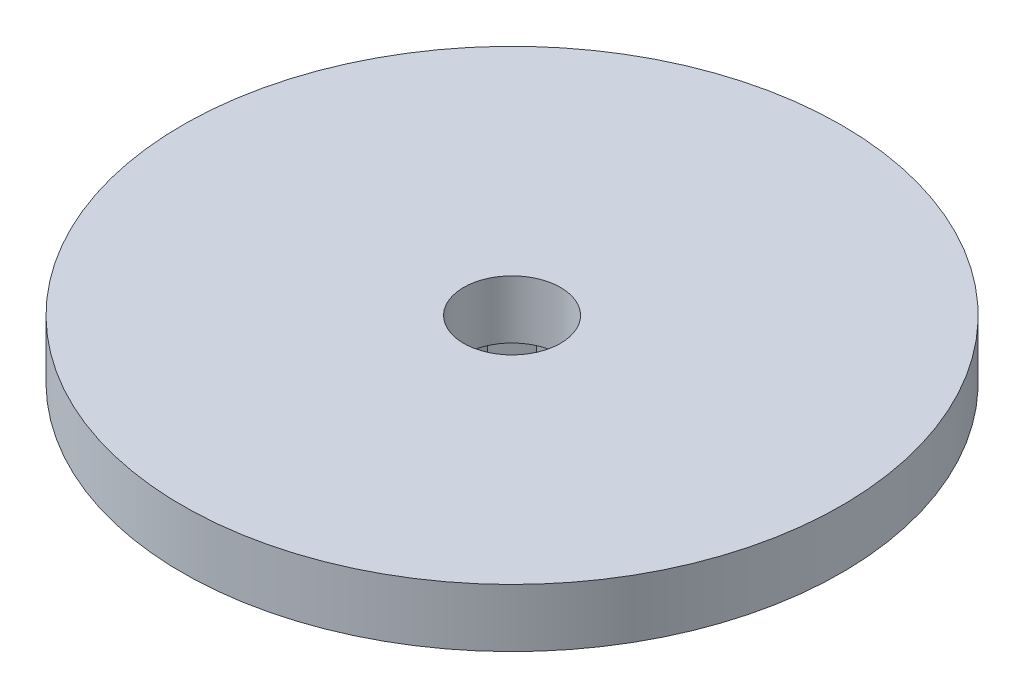
ISO-10303-21;
HEADER;
FILE_DESCRIPTION(('STEP AP214'),'2;1');
FILE_NAME('part.step','',(''),(''),'','','');
FILE_SCHEMA(('AUTOMOTIVE_DESIGN { 1 0 10303 214 1 1 1 1 }'));
ENDSEC;
DATA;
#1=APPLICATION_CONTEXT('core data for automotive mechanical design processes');
#2=APPLICATION_PROTOCOL_DEFINITION('international standard','automotive_design',2000,#1);
#3=PRODUCT_CONTEXT('',#1,'mechanical');
#4=PRODUCT('Part','Part','',(#3));
#5=PRODUCT_RELATED_PRODUCT_CATEGORY('part','',(#4));
#6=PRODUCT_DEFINITION_FORMATION('','',#4);
#7=PRODUCT_DEFINITION_CONTEXT('part definition',#1,'design');
#8=PRODUCT_DEFINITION('design','',#6,#7);
#9=PRODUCT_DEFINITION_SHAPE('','',#8);
#10=(LENGTH_UNIT() NAMED_UNIT(*) SI_UNIT(.MILLI.,.METRE.));
#11=(NAMED_UNIT(*) PLANE_ANGLE_UNIT() SI_UNIT($,.RADIAN.));
#12=(NAMED_UNIT(*) SI_UNIT($,.STERADIAN.) SOLID_ANGLE_UNIT());
#13=UNCERTAINTY_MEASURE_WITH_UNIT(LENGTH_MEASURE(1.E-05),#10,'distance_accuracy_value','');
#14=(GEOMETRIC_REPRESENTATION_CONTEXT(3) GLOBAL_UNCERTAINTY_ASSIGNED_CONTEXT((#13)) GLOBAL_UNIT_ASSIGNED_CONTEXT((#10,
#11,#12)) REPRESENTATION_CONTEXT('',''));
#15=CARTESIAN_POINT('',(0.,0.,0.));
#16=DIRECTION('',(0.,0.,1.));
#17=DIRECTION('',(1.,0.,0.));
#18=AXIS2_PLACEMENT_3D('',#15,#16,#17);
#19=CARTESIAN_POINT('',(0.,0.,0.));
#20=DIRECTION('',(0.,-1.,0.));
#21=DIRECTION('',(0.,0.,-1.));
#22=AXIS2_PLACEMENT_3D('',#19,#20,#21);
#23=CYLINDRICAL_SURFACE('',#22,8.5);
#24=CARTESIAN_POINT('',(0.,2.2,0.));
#25=DIRECTION('',(0.,-1.,0.));
#26=DIRECTION('',(0.,0.,-1.));
#27=AXIS2_PLACEMENT_3D('',#24,#25,#26);
#28=CIRCLE('',#27,8.5);
#29=CARTESIAN_POINT('',(0.,2.2,-8.5));
#30=VERTEX_POINT('',#29);
#31=EDGE_CURVE('E11',#30,#30,#28,.T.);
#32=ORIENTED_EDGE('',*,*,#31,.F.);
#33=EDGE_LOOP('',(#32));
#34=FACE_BOUND('',#33,.T.);
#35=CARTESIAN_POINT('',(0.,3.7,0.));
#36=DIRECTION('',(0.,-1.,0.));
#37=DIRECTION('',(0.,0.,-1.));
#38=AXIS2_PLACEMENT_3D('',#35,#36,#37);
#39=CIRCLE('',#38,8.5);
#40=CARTESIAN_POINT('',(0.,3.7,-8.5));
#41=VERTEX_POINT('',#40);
#42=EDGE_CURVE('E224',#41,#41,#39,.T.);
#43=ORIENTED_EDGE('',*,*,#42,.T.);
#44=EDGE_LOOP('',(#43));
#45=FACE_BOUND('',#44,.T.);
#46=ADVANCED_FACE('F33',(#34,#45),#23,.T.);
#47=CARTESIAN_POINT('',(-8.5,2.2,0.));
#48=DIRECTION('',(0.,1.,0.));
#49=DIRECTION('',(0.,0.,1.));
#50=AXIS2_PLACEMENT_3D('',#47,#48,#49);
#51=PLANE('',#50);
#52=CARTESIAN_POINT('',(0.,2.2,0.));
#53=DIRECTION('',(0.,-1.,0.));
#54=DIRECTION('',(0.,0.,-1.));
#55=AXIS2_PLACEMENT_3D('',#52,#53,#54);
#56=CIRCLE('',#55,3.9);
#57=CARTESIAN_POINT('',(0.,2.2,-3.9));
#58=VERTEX_POINT('',#57);
#59=EDGE_CURVE('E40',#58,#58,#56,.T.);
#60=ORIENTED_EDGE('',*,*,#59,.F.);
#61=EDGE_LOOP('',(#60));
#62=FACE_BOUND('',#61,.T.);
#63=ORIENTED_EDGE('',*,*,#31,.T.);
#64=EDGE_LOOP('',(#63));
#65=FACE_BOUND('',#64,.T.);
#66=ADVANCED_FACE('F265',(#62,#65),#51,.F.);
#67=CARTESIAN_POINT('',(0.,0.,0.));
#68=DIRECTION('',(0.,-1.,0.));
#69=DIRECTION('',(0.,0.,-1.));
#70=AXIS2_PLACEMENT_3D('',#67,#68,#69);
#71=CYLINDRICAL_SURFACE('',#70,3.9);
#72=CARTESIAN_POINT('',(0.,0.,0.));
#73=DIRECTION('',(0.,-1.,0.));
#74=DIRECTION('',(0.,0.,-1.));
#75=AXIS2_PLACEMENT_3D('',#72,#73,#74);
#76=CIRCLE('',#75,3.9);
#77=CARTESIAN_POINT('',(0.,0.,-3.9));
#78=VERTEX_POINT('',#77);
#79=EDGE_CURVE('E258',#78,#78,#76,.T.);
#80=ORIENTED_EDGE('',*,*,#79,.F.);
#81=EDGE_LOOP('',(#80));
#82=FACE_BOUND('',#81,.T.);
#83=ORIENTED_EDGE('',*,*,#59,.T.);
#84=EDGE_LOOP('',(#83));
#85=FACE_BOUND('',#84,.T.);
#86=ADVANCED_FACE('F263',(#82,#85),#71,.T.);
#87=CARTESIAN_POINT('',(-3.9,0.,0.));
#88=DIRECTION('',(0.,1.,0.));
#89=DIRECTION('',(0.,0.,1.));
#90=AXIS2_PLACEMENT_3D('',#87,#88,#89);
#91=PLANE('',#90);
#92=DIRECTION('',(0.707106781186547,0.,0.707106781186548));
#93=VECTOR('',#92,1.);
#94=CARTESIAN_POINT('',(1.27452261903867,0.,-1.90745789630079));
#95=LINE('',#94,#93);
#96=CARTESIAN_POINT('',(1.27452261903867,0.,-1.90745789630079));
#97=VERTEX_POINT('',#96);
#98=CARTESIAN_POINT('',(1.90745789630079,0.,-1.27452261903867));
#99=VERTEX_POINT('',#98);
#100=EDGE_CURVE('E181',#97,#99,#95,.T.);
#101=ORIENTED_EDGE('',*,*,#100,.F.);
#102=DIRECTION('',(0.923879532511287,0.,0.38268343236509));
#103=VECTOR('',#102,1.);
#104=CARTESIAN_POINT('',(0.44755282660423,0.,-2.25));
#105=LINE('',#104,#103);
#106=CARTESIAN_POINT('',(0.44755282660423,0.,-2.25));
#107=VERTEX_POINT('',#106);
#108=EDGE_CURVE('E47',#107,#97,#105,.T.);
#109=ORIENTED_EDGE('',*,*,#108,.F.);
#110=DIRECTION('',(1.,0.,0.));
#111=VECTOR('',#110,1.);
#112=CARTESIAN_POINT('',(-0.447552826604228,0.,-2.25));
#113=LINE('',#112,#111);
#114=CARTESIAN_POINT('',(-0.447552826604228,0.,-2.25));
#115=VERTEX_POINT('',#114);
#116=EDGE_CURVE('E220',#115,#107,#113,.T.);
#117=ORIENTED_EDGE('',*,*,#116,.F.);
#118=DIRECTION('',(0.923879532511287,0.,-0.382683432365089));
#119=VECTOR('',#118,1.);
#120=CARTESIAN_POINT('',(-1.27452261903867,0.,-1.90745789630079));
#121=LINE('',#120,#119);
#122=CARTESIAN_POINT('',(-1.27452261903867,0.,-1.90745789630079));
#123=VERTEX_POINT('',#122);
#124=EDGE_CURVE('E218',#123,#115,#121,.T.);
#125=ORIENTED_EDGE('',*,*,#124,.F.);
#126=DIRECTION('',(0.707106781186548,0.,-0.707106781186548));
#127=VECTOR('',#126,1.);
#128=CARTESIAN_POINT('',(-1.90745789630079,0.,-1.27452261903867));
#129=LINE('',#128,#127);
#130=CARTESIAN_POINT('',(-1.90745789630079,0.,-1.27452261903867));
#131=VERTEX_POINT('',#130);
#132=EDGE_CURVE('E155',#131,#123,#129,.T.);
#133=ORIENTED_EDGE('',*,*,#132,.F.);
#134=DIRECTION('',(0.38268343236509,0.,-0.923879532511287));
#135=VECTOR('',#134,1.);
#136=CARTESIAN_POINT('',(-2.25,0.,-0.44755282660423));
#137=LINE('',#136,#135);
#138=CARTESIAN_POINT('',(-2.25,0.,-0.44755282660423));
#139=VERTEX_POINT('',#138);
#140=EDGE_CURVE('E214',#139,#131,#137,.T.);
#141=ORIENTED_EDGE('',*,*,#140,.F.);
#142=DIRECTION('',(0.,0.,-1.));
#143=VECTOR('',#142,1.);
#144=CARTESIAN_POINT('',(-2.25,0.,0.447552826604228));
#145=LINE('',#144,#143);
#146=CARTESIAN_POINT('',(-2.25,0.,0.447552826604228));
#147=VERTEX_POINT('',#146);
#148=EDGE_CURVE('E211',#147,#139,#145,.T.);
#149=ORIENTED_EDGE('',*,*,#148,.F.);
#150=DIRECTION('',(-0.382683432365089,0.,-0.923879532511287));
#151=VECTOR('',#150,1.);
#152=CARTESIAN_POINT('',(-1.90745789630079,0.,1.27452261903867));
#153=LINE('',#152,#151);
#154=CARTESIAN_POINT('',(-1.90745789630079,0.,1.27452261903867));
#155=VERTEX_POINT('',#154);
#156=EDGE_CURVE('E208',#155,#147,#153,.T.);
#157=ORIENTED_EDGE('',*,*,#156,.F.);
#158=DIRECTION('',(-0.707106781186547,0.,-0.707106781186548));
#159=VECTOR('',#158,1.);
#160=CARTESIAN_POINT('',(-1.27452261903867,0.,1.90745789630079));
#161=LINE('',#160,#159);
#162=CARTESIAN_POINT('',(-1.27452261903867,0.,1.90745789630079));
#163=VERTEX_POINT('',#162);
#164=EDGE_CURVE('E205',#163,#155,#161,.T.);
#165=ORIENTED_EDGE('',*,*,#164,.F.);
#166=DIRECTION('',(-0.923879532511287,0.,-0.38268343236509));
#167=VECTOR('',#166,1.);
#168=CARTESIAN_POINT('',(-0.44755282660423,0.,2.25));
#169=LINE('',#168,#167);
#170=CARTESIAN_POINT('',(-0.44755282660423,0.,2.25));
#171=VERTEX_POINT('',#170);
#172=EDGE_CURVE('E202',#171,#163,#169,.T.);
#173=ORIENTED_EDGE('',*,*,#172,.F.);
#174=DIRECTION('',(-1.,0.,0.));
#175=VECTOR('',#174,1.);
#176=CARTESIAN_POINT('',(0.447552826604228,0.,2.25));
#177=LINE('',#176,#175);
#178=CARTESIAN_POINT('',(0.447552826604228,0.,2.25));
#179=VERTEX_POINT('',#178);
#180=EDGE_CURVE('E199',#179,#171,#177,.T.);
#181=ORIENTED_EDGE('',*,*,#180,.F.);
#182=DIRECTION('',(-0.923879532511287,0.,0.382683432365089));
#183=VECTOR('',#182,1.);
#184=CARTESIAN_POINT('',(1.27452261903867,0.,1.90745789630079));
#185=LINE('',#184,#183);
#186=CARTESIAN_POINT('',(1.27452261903867,0.,1.90745789630079));
#187=VERTEX_POINT('',#186);
#188=EDGE_CURVE('E196',#187,#179,#185,.T.);
#189=ORIENTED_EDGE('',*,*,#188,.F.);
#190=DIRECTION('',(-0.707106781186548,0.,0.707106781186547));
#191=VECTOR('',#190,1.);
#192=CARTESIAN_POINT('',(1.90745789630079,0.,1.27452261903867));
#193=LINE('',#192,#191);
#194=CARTESIAN_POINT('',(1.90745789630079,0.,1.27452261903867));
#195=VERTEX_POINT('',#194);
#196=EDGE_CURVE('E193',#195,#187,#193,.T.);
#197=ORIENTED_EDGE('',*,*,#196,.F.);
#198=DIRECTION('',(-0.38268343236509,0.,0.923879532511287));
#199=VECTOR('',#198,1.);
#200=CARTESIAN_POINT('',(2.25,0.,0.447552826604231));
#201=LINE('',#200,#199);
#202=CARTESIAN_POINT('',(2.25,0.,0.447552826604231));
#203=VERTEX_POINT('',#202);
#204=EDGE_CURVE('E190',#203,#195,#201,.T.);
#205=ORIENTED_EDGE('',*,*,#204,.F.);
#206=DIRECTION('',(0.,0.,1.));
#207=VECTOR('',#206,1.);
#208=CARTESIAN_POINT('',(2.25,0.,-0.447552826604229));
#209=LINE('',#208,#207);
#210=CARTESIAN_POINT('',(2.25,0.,-0.447552826604229));
#211=VERTEX_POINT('',#210);
#212=EDGE_CURVE('E187',#211,#203,#209,.T.);
#213=ORIENTED_EDGE('',*,*,#212,.F.);
#214=DIRECTION('',(0.382683432365089,0.,0.923879532511287));
#215=VECTOR('',#214,1.);
#216=CARTESIAN_POINT('',(1.90745789630079,0.,-1.27452261903867));
#217=LINE('',#216,#215);
#218=EDGE_CURVE('E184',#99,#211,#217,.T.);
#219=ORIENTED_EDGE('',*,*,#218,.F.);
#220=EDGE_LOOP('',(#101,#109,#117,#125,#133,#141,#149,#157,#165,#173,#181,#189,#197,#205,#213,#219));
#221=FACE_BOUND('',#220,.T.);
#222=ORIENTED_EDGE('',*,*,#79,.T.);
#223=EDGE_LOOP('',(#222));
#224=FACE_BOUND('',#223,.T.);
#225=ADVANCED_FACE('F288',(#221,#224),#91,.F.);
#226=CARTESIAN_POINT('',(-2.2,2.2,0.));
#227=DIRECTION('',(0.,1.,0.));
#228=DIRECTION('',(0.,0.,1.));
#229=AXIS2_PLACEMENT_3D('',#226,#227,#228);
#230=PLANE('',#229);
#231=CARTESIAN_POINT('',(0.,2.2,0.));
#232=DIRECTION('',(0.,-1.,0.));
#233=DIRECTION('',(0.,0.,-1.));
#234=AXIS2_PLACEMENT_3D('',#231,#232,#233);
#235=CIRCLE('',#234,1.25);
#236=CARTESIAN_POINT('',(0.,2.2,-1.25));
#237=VERTEX_POINT('',#236);
#238=EDGE_CURVE('E255',#237,#237,#235,.T.);
#239=ORIENTED_EDGE('',*,*,#238,.F.);
#240=EDGE_LOOP('',(#239));
#241=FACE_BOUND('',#240,.T.);
#242=DIRECTION('',(0.923879532511287,0.,0.38268343236509));
#243=VECTOR('',#242,1.);
#244=CARTESIAN_POINT('',(0.44755282660423,2.2,-2.25));
#245=LINE('',#244,#243);
#246=CARTESIAN_POINT('',(0.44755282660423,2.2,-2.25));
#247=VERTEX_POINT('',#246);
#248=CARTESIAN_POINT('',(1.27452261903867,2.2,-1.90745789630079));
#249=VERTEX_POINT('',#248);
#250=EDGE_CURVE('E222',#247,#249,#245,.T.);
#251=ORIENTED_EDGE('',*,*,#250,.T.);
#252=DIRECTION('',(0.707106781186547,0.,0.707106781186548));
#253=VECTOR('',#252,1.);
#254=CARTESIAN_POINT('',(1.27452261903867,2.2,-1.90745789630079));
#255=LINE('',#254,#253);
#256=CARTESIAN_POINT('',(1.90745789630079,2.2,-1.27452261903867));
#257=VERTEX_POINT('',#256);
#258=EDGE_CURVE('E485',#249,#257,#255,.T.);
#259=ORIENTED_EDGE('',*,*,#258,.T.);
#260=DIRECTION('',(0.382683432365089,0.,0.923879532511287));
#261=VECTOR('',#260,1.);
#262=CARTESIAN_POINT('',(1.90745789630079,2.2,-1.27452261903867));
#263=LINE('',#262,#261);
#264=CARTESIAN_POINT('',(2.25,2.2,-0.447552826604229));
#265=VERTEX_POINT('',#264);
#266=EDGE_CURVE('E481',#257,#265,#263,.T.);
#267=ORIENTED_EDGE('',*,*,#266,.T.);
#268=DIRECTION('',(0.,0.,1.));
#269=VECTOR('',#268,1.);
#270=CARTESIAN_POINT('',(2.25,2.2,-0.447552826604229));
#271=LINE('',#270,#269);
#272=CARTESIAN_POINT('',(2.25,2.2,0.447552826604231));
#273=VERTEX_POINT('',#272);
#274=EDGE_CURVE('E484',#265,#273,#271,.T.);
#275=ORIENTED_EDGE('',*,*,#274,.T.);
#276=DIRECTION('',(-0.38268343236509,0.,0.923879532511287));
#277=VECTOR('',#276,1.);
#278=CARTESIAN_POINT('',(2.25,2.2,0.447552826604231));
#279=LINE('',#278,#277);
#280=CARTESIAN_POINT('',(1.90745789630079,2.2,1.27452261903867));
#281=VERTEX_POINT('',#280);
#282=EDGE_CURVE('E491',#273,#281,#279,.T.);
#283=ORIENTED_EDGE('',*,*,#282,.T.);
#284=DIRECTION('',(-0.707106781186548,0.,0.707106781186547));
#285=VECTOR('',#284,1.);
#286=CARTESIAN_POINT('',(1.90745789630079,2.2,1.27452261903867));
#287=LINE('',#286,#285);
#288=CARTESIAN_POINT('',(1.27452261903867,2.2,1.90745789630079));
#289=VERTEX_POINT('',#288);
#290=EDGE_CURVE('E494',#281,#289,#287,.T.);
#291=ORIENTED_EDGE('',*,*,#290,.T.);
#292=DIRECTION('',(-0.923879532511287,0.,0.382683432365089));
#293=VECTOR('',#292,1.);
#294=CARTESIAN_POINT('',(1.27452261903867,2.2,1.90745789630079));
#295=LINE('',#294,#293);
#296=CARTESIAN_POINT('',(0.447552826604228,2.2,2.25));
#297=VERTEX_POINT('',#296);
#298=EDGE_CURVE('E497',#289,#297,#295,.T.);
#299=ORIENTED_EDGE('',*,*,#298,.T.);
#300=DIRECTION('',(-1.,0.,0.));
#301=VECTOR('',#300,1.);
#302=CARTESIAN_POINT('',(0.447552826604228,2.2,2.25));
#303=LINE('',#302,#301);
#304=CARTESIAN_POINT('',(-0.44755282660423,2.2,2.25));
#305=VERTEX_POINT('',#304);
#306=EDGE_CURVE('E500',#297,#305,#303,.T.);
#307=ORIENTED_EDGE('',*,*,#306,.T.);
#308=DIRECTION('',(-0.923879532511287,0.,-0.38268343236509));
#309=VECTOR('',#308,1.);
#310=CARTESIAN_POINT('',(-0.44755282660423,2.2,2.25));
#311=LINE('',#310,#309);
#312=CARTESIAN_POINT('',(-1.27452261903867,2.2,1.90745789630079));
#313=VERTEX_POINT('',#312);
#314=EDGE_CURVE('E503',#305,#313,#311,.T.);
#315=ORIENTED_EDGE('',*,*,#314,.T.);
#316=DIRECTION('',(-0.707106781186547,0.,-0.707106781186548));
#317=VECTOR('',#316,1.);
#318=CARTESIAN_POINT('',(-1.27452261903867,2.2,1.90745789630079));
#319=LINE('',#318,#317);
#320=CARTESIAN_POINT('',(-1.90745789630079,2.2,1.27452261903867));
#321=VERTEX_POINT('',#320);
#322=EDGE_CURVE('E506',#313,#321,#319,.T.);
#323=ORIENTED_EDGE('',*,*,#322,.T.);
#324=DIRECTION('',(-0.382683432365089,0.,-0.923879532511287));
#325=VECTOR('',#324,1.);
#326=CARTESIAN_POINT('',(-1.90745789630079,2.2,1.27452261903867));
#327=LINE('',#326,#325);
#328=CARTESIAN_POINT('',(-2.25,2.2,0.447552826604228));
#329=VERTEX_POINT('',#328);
#330=EDGE_CURVE('E509',#321,#329,#327,.T.);
#331=ORIENTED_EDGE('',*,*,#330,.T.);
#332=DIRECTION('',(0.,0.,-1.));
#333=VECTOR('',#332,1.);
#334=CARTESIAN_POINT('',(-2.25,2.2,0.447552826604228));
#335=LINE('',#334,#333);
#336=CARTESIAN_POINT('',(-2.25,2.2,-0.44755282660423));
#337=VERTEX_POINT('',#336);
#338=EDGE_CURVE('E175',#329,#337,#335,.T.);
#339=ORIENTED_EDGE('',*,*,#338,.T.);
#340=DIRECTION('',(0.38268343236509,0.,-0.923879532511287));
#341=VECTOR('',#340,1.);
#342=CARTESIAN_POINT('',(-2.25,2.2,-0.44755282660423));
#343=LINE('',#342,#341);
#344=CARTESIAN_POINT('',(-1.90745789630079,2.2,-1.27452261903867));
#345=VERTEX_POINT('',#344);
#346=EDGE_CURVE('E173',#337,#345,#343,.T.);
#347=ORIENTED_EDGE('',*,*,#346,.T.);
#348=DIRECTION('',(0.707106781186548,0.,-0.707106781186548));
#349=VECTOR('',#348,1.);
#350=CARTESIAN_POINT('',(-1.90745789630079,2.2,-1.27452261903867));
#351=LINE('',#350,#349);
#352=CARTESIAN_POINT('',(-1.27452261903867,2.2,-1.90745789630079));
#353=VERTEX_POINT('',#352);
#354=EDGE_CURVE('E152',#345,#353,#351,.T.);
#355=ORIENTED_EDGE('',*,*,#354,.T.);
#356=DIRECTION('',(0.923879532511287,0.,-0.382683432365089));
#357=VECTOR('',#356,1.);
#358=CARTESIAN_POINT('',(-1.27452261903867,2.2,-1.90745789630079));
#359=LINE('',#358,#357);
#360=CARTESIAN_POINT('',(-0.447552826604228,2.2,-2.25));
#361=VERTEX_POINT('',#360);
#362=EDGE_CURVE('E163',#353,#361,#359,.T.);
#363=ORIENTED_EDGE('',*,*,#362,.T.);
#364=DIRECTION('',(1.,0.,0.));
#365=VECTOR('',#364,1.);
#366=CARTESIAN_POINT('',(-0.447552826604228,2.2,-2.25));
#367=LINE('',#366,#365);
#368=EDGE_CURVE('E167',#361,#247,#367,.T.);
#369=ORIENTED_EDGE('',*,*,#368,.T.);
#370=EDGE_LOOP('',(#251,#259,#267,#275,#283,#291,#299,#307,#315,#323,#331,#339,#347,#355,#363,#369));
#371=FACE_BOUND('',#370,.T.);
#372=ADVANCED_FACE('F170',(#241,#371),#230,.F.);
#373=CARTESIAN_POINT('',(0.,0.,0.));
#374=DIRECTION('',(0.,-1.,0.));
#375=DIRECTION('',(0.,0.,-1.));
#376=AXIS2_PLACEMENT_3D('',#373,#374,#375);
#377=CYLINDRICAL_SURFACE('',#376,1.25);
#378=CARTESIAN_POINT('',(0.,3.7,0.));
#379=DIRECTION('',(0.,-1.,0.));
#380=DIRECTION('',(0.,0.,-1.));
#381=AXIS2_PLACEMENT_3D('',#378,#379,#380);
#382=CIRCLE('',#381,1.25);
#383=CARTESIAN_POINT('',(0.,3.7,-1.25));
#384=VERTEX_POINT('',#383);
#385=EDGE_CURVE('E252',#384,#384,#382,.T.);
#386=ORIENTED_EDGE('',*,*,#385,.F.);
#387=EDGE_LOOP('',(#386));
#388=FACE_BOUND('',#387,.T.);
#389=ORIENTED_EDGE('',*,*,#238,.T.);
#390=EDGE_LOOP('',(#389));
#391=FACE_BOUND('',#390,.T.);
#392=ADVANCED_FACE('F278',(#388,#391),#377,.F.);
#393=CARTESIAN_POINT('',(-8.5,3.7,0.));
#394=DIRECTION('',(0.,-1.,0.));
#395=DIRECTION('',(0.,0.,-1.));
#396=AXIS2_PLACEMENT_3D('',#393,#394,#395);
#397=PLANE('',#396);
#398=ORIENTED_EDGE('',*,*,#42,.F.);
#399=EDGE_LOOP('',(#398));
#400=FACE_BOUND('',#399,.T.);
#401=ORIENTED_EDGE('',*,*,#385,.T.);
#402=EDGE_LOOP('',(#401));
#403=FACE_BOUND('',#402,.T.);
#404=ADVANCED_FACE('F274',(#400,#403),#397,.F.);
#405=CARTESIAN_POINT('',(0.44755282660423,2.2,-2.25));
#406=DIRECTION('',(0.38268343236509,0.,-0.923879532511287));
#407=DIRECTION('',(-0.923879532511287,0.,-0.38268343236509));
#408=AXIS2_PLACEMENT_3D('',#405,#406,#407);
#409=PLANE('',#408);
#410=ORIENTED_EDGE('',*,*,#108,.T.);
#411=DIRECTION('',(0.,-1.,0.));
#412=VECTOR('',#411,1.);
#413=CARTESIAN_POINT('',(1.27452261903867,2.2,-1.90745789630079));
#414=LINE('',#413,#412);
#415=EDGE_CURVE('E107',#249,#97,#414,.T.);
#416=ORIENTED_EDGE('',*,*,#415,.F.);
#417=ORIENTED_EDGE('',*,*,#250,.F.);
#418=DIRECTION('',(0.,-1.,0.));
#419=VECTOR('',#418,1.);
#420=CARTESIAN_POINT('',(0.44755282660423,2.2,-2.25));
#421=LINE('',#420,#419);
#422=EDGE_CURVE('E55',#247,#107,#421,.T.);
#423=ORIENTED_EDGE('',*,*,#422,.T.);
#424=EDGE_LOOP('',(#410,#416,#417,#423));
#425=FACE_BOUND('',#424,.T.);
#426=ADVANCED_FACE('F277',(#425),#409,.F.);
#427=CARTESIAN_POINT('',(-0.447552826604228,2.2,-2.25));
#428=DIRECTION('',(0.,0.,-1.));
#429=DIRECTION('',(-1.,0.,0.));
#430=AXIS2_PLACEMENT_3D('',#427,#428,#429);
#431=PLANE('',#430);
#432=ORIENTED_EDGE('',*,*,#116,.T.);
#433=ORIENTED_EDGE('',*,*,#422,.F.);
#434=ORIENTED_EDGE('',*,*,#368,.F.);
#435=DIRECTION('',(0.,-1.,0.));
#436=VECTOR('',#435,1.);
#437=CARTESIAN_POINT('',(-0.447552826604228,2.2,-2.25));
#438=LINE('',#437,#436);
#439=EDGE_CURVE('E159',#361,#115,#438,.T.);
#440=ORIENTED_EDGE('',*,*,#439,.T.);
#441=EDGE_LOOP('',(#432,#433,#434,#440));
#442=FACE_BOUND('',#441,.T.);
#443=ADVANCED_FACE('F326',(#442),#431,.F.);
#444=CARTESIAN_POINT('',(-1.27452261903867,2.2,-1.90745789630079));
#445=DIRECTION('',(-0.382683432365089,0.,-0.923879532511287));
#446=DIRECTION('',(-0.923879532511287,0.,0.382683432365089));
#447=AXIS2_PLACEMENT_3D('',#444,#445,#446);
#448=PLANE('',#447);
#449=ORIENTED_EDGE('',*,*,#124,.T.);
#450=ORIENTED_EDGE('',*,*,#439,.F.);
#451=ORIENTED_EDGE('',*,*,#362,.F.);
#452=DIRECTION('',(0.,-1.,0.));
#453=VECTOR('',#452,1.);
#454=CARTESIAN_POINT('',(-1.27452261903867,2.2,-1.90745789630079));
#455=LINE('',#454,#453);
#456=EDGE_CURVE('E148',#353,#123,#455,.T.);
#457=ORIENTED_EDGE('',*,*,#456,.T.);
#458=EDGE_LOOP('',(#449,#450,#451,#457));
#459=FACE_BOUND('',#458,.T.);
#460=ADVANCED_FACE('F164',(#459),#448,.F.);
#461=CARTESIAN_POINT('',(-1.90745789630079,2.2,-1.27452261903867));
#462=DIRECTION('',(-0.707106781186548,0.,-0.707106781186548));
#463=DIRECTION('',(-0.707106781186548,0.,0.707106781186548));
#464=AXIS2_PLACEMENT_3D('',#461,#462,#463);
#465=PLANE('',#464);
#466=ORIENTED_EDGE('',*,*,#132,.T.);
#467=ORIENTED_EDGE('',*,*,#456,.F.);
#468=ORIENTED_EDGE('',*,*,#354,.F.);
#469=DIRECTION('',(0.,-1.,0.));
#470=VECTOR('',#469,1.);
#471=CARTESIAN_POINT('',(-1.90745789630079,2.2,-1.27452261903867));
#472=LINE('',#471,#470);
#473=EDGE_CURVE('E160',#345,#131,#472,.T.);
#474=ORIENTED_EDGE('',*,*,#473,.T.);
#475=EDGE_LOOP('',(#466,#467,#468,#474));
#476=FACE_BOUND('',#475,.T.);
#477=ADVANCED_FACE('F150',(#476),#465,.F.);
#478=CARTESIAN_POINT('',(-2.25,2.2,-0.44755282660423));
#479=DIRECTION('',(-0.923879532511287,0.,-0.38268343236509));
#480=DIRECTION('',(-0.38268343236509,0.,0.923879532511287));
#481=AXIS2_PLACEMENT_3D('',#478,#479,#480);
#482=PLANE('',#481);
#483=ORIENTED_EDGE('',*,*,#140,.T.);
#484=ORIENTED_EDGE('',*,*,#473,.F.);
#485=ORIENTED_EDGE('',*,*,#346,.F.);
#486=DIRECTION('',(0.,-1.,0.));
#487=VECTOR('',#486,1.);
#488=CARTESIAN_POINT('',(-2.25,2.2,-0.44755282660423));
#489=LINE('',#488,#487);
#490=EDGE_CURVE('E227',#337,#139,#489,.T.);
#491=ORIENTED_EDGE('',*,*,#490,.T.);
#492=EDGE_LOOP('',(#483,#484,#485,#491));
#493=FACE_BOUND('',#492,.T.);
#494=ADVANCED_FACE('F351',(#493),#482,.F.);
#495=CARTESIAN_POINT('',(-2.25,2.2,0.447552826604228));
#496=DIRECTION('',(-1.,0.,0.));
#497=DIRECTION('',(0.,0.,1.));
#498=AXIS2_PLACEMENT_3D('',#495,#496,#497);
#499=PLANE('',#498);
#500=ORIENTED_EDGE('',*,*,#148,.T.);
#501=ORIENTED_EDGE('',*,*,#490,.F.);
#502=ORIENTED_EDGE('',*,*,#338,.F.);
#503=DIRECTION('',(0.,-1.,0.));
#504=VECTOR('',#503,1.);
#505=CARTESIAN_POINT('',(-2.25,2.2,0.447552826604228));
#506=LINE('',#505,#504);
#507=EDGE_CURVE('E229',#329,#147,#506,.T.);
#508=ORIENTED_EDGE('',*,*,#507,.T.);
#509=EDGE_LOOP('',(#500,#501,#502,#508));
#510=FACE_BOUND('',#509,.T.);
#511=ADVANCED_FACE('F360',(#510),#499,.F.);
#512=CARTESIAN_POINT('',(-1.90745789630079,2.2,1.27452261903867));
#513=DIRECTION('',(-0.923879532511287,0.,0.382683432365089));
#514=DIRECTION('',(0.382683432365089,0.,0.923879532511287));
#515=AXIS2_PLACEMENT_3D('',#512,#513,#514);
#516=PLANE('',#515);
#517=ORIENTED_EDGE('',*,*,#156,.T.);
#518=ORIENTED_EDGE('',*,*,#507,.F.);
#519=ORIENTED_EDGE('',*,*,#330,.F.);
#520=DIRECTION('',(0.,-1.,0.));
#521=VECTOR('',#520,1.);
#522=CARTESIAN_POINT('',(-1.90745789630079,2.2,1.27452261903867));
#523=LINE('',#522,#521);
#524=EDGE_CURVE('E231',#321,#155,#523,.T.);
#525=ORIENTED_EDGE('',*,*,#524,.T.);
#526=EDGE_LOOP('',(#517,#518,#519,#525));
#527=FACE_BOUND('',#526,.T.);
#528=ADVANCED_FACE('F370',(#527),#516,.F.);
#529=CARTESIAN_POINT('',(-1.27452261903867,2.2,1.90745789630079));
#530=DIRECTION('',(-0.707106781186548,0.,0.707106781186547));
#531=DIRECTION('',(0.707106781186547,0.,0.707106781186548));
#532=AXIS2_PLACEMENT_3D('',#529,#530,#531);
#533=PLANE('',#532);
#534=ORIENTED_EDGE('',*,*,#164,.T.);
#535=ORIENTED_EDGE('',*,*,#524,.F.);
#536=ORIENTED_EDGE('',*,*,#322,.F.);
#537=DIRECTION('',(0.,-1.,0.));
#538=VECTOR('',#537,1.);
#539=CARTESIAN_POINT('',(-1.27452261903867,2.2,1.90745789630079));
#540=LINE('',#539,#538);
#541=EDGE_CURVE('E233',#313,#163,#540,.T.);
#542=ORIENTED_EDGE('',*,*,#541,.T.);
#543=EDGE_LOOP('',(#534,#535,#536,#542));
#544=FACE_BOUND('',#543,.T.);
#545=ADVANCED_FACE('F380',(#544),#533,.F.);
#546=CARTESIAN_POINT('',(-0.44755282660423,2.2,2.25));
#547=DIRECTION('',(-0.38268343236509,0.,0.923879532511287));
#548=DIRECTION('',(0.923879532511287,0.,0.38268343236509));
#549=AXIS2_PLACEMENT_3D('',#546,#547,#548);
#550=PLANE('',#549);
#551=ORIENTED_EDGE('',*,*,#172,.T.);
#552=ORIENTED_EDGE('',*,*,#541,.F.);
#553=ORIENTED_EDGE('',*,*,#314,.F.);
#554=DIRECTION('',(0.,-1.,0.));
#555=VECTOR('',#554,1.);
#556=CARTESIAN_POINT('',(-0.44755282660423,2.2,2.25));
#557=LINE('',#556,#555);
#558=EDGE_CURVE('E235',#305,#171,#557,.T.);
#559=ORIENTED_EDGE('',*,*,#558,.T.);
#560=EDGE_LOOP('',(#551,#552,#553,#559));
#561=FACE_BOUND('',#560,.T.);
#562=ADVANCED_FACE('F390',(#561),#550,.F.);
#563=CARTESIAN_POINT('',(0.447552826604228,2.2,2.25));
#564=DIRECTION('',(0.,0.,1.));
#565=DIRECTION('',(1.,0.,0.));
#566=AXIS2_PLACEMENT_3D('',#563,#564,#565);
#567=PLANE('',#566);
#568=ORIENTED_EDGE('',*,*,#180,.T.);
#569=ORIENTED_EDGE('',*,*,#558,.F.);
#570=ORIENTED_EDGE('',*,*,#306,.F.);
#571=DIRECTION('',(0.,-1.,0.));
#572=VECTOR('',#571,1.);
#573=CARTESIAN_POINT('',(0.447552826604228,2.2,2.25));
#574=LINE('',#573,#572);
#575=EDGE_CURVE('E237',#297,#179,#574,.T.);
#576=ORIENTED_EDGE('',*,*,#575,.T.);
#577=EDGE_LOOP('',(#568,#569,#570,#576));
#578=FACE_BOUND('',#577,.T.);
#579=ADVANCED_FACE('F400',(#578),#567,.F.);
#580=CARTESIAN_POINT('',(1.27452261903867,2.2,1.90745789630079));
#581=DIRECTION('',(0.382683432365089,0.,0.923879532511287));
#582=DIRECTION('',(0.923879532511287,0.,-0.382683432365089));
#583=AXIS2_PLACEMENT_3D('',#580,#581,#582);
#584=PLANE('',#583);
#585=ORIENTED_EDGE('',*,*,#188,.T.);
#586=ORIENTED_EDGE('',*,*,#575,.F.);
#587=ORIENTED_EDGE('',*,*,#298,.F.);
#588=DIRECTION('',(0.,-1.,0.));
#589=VECTOR('',#588,1.);
#590=CARTESIAN_POINT('',(1.27452261903867,2.2,1.90745789630079));
#591=LINE('',#590,#589);
#592=EDGE_CURVE('E239',#289,#187,#591,.T.);
#593=ORIENTED_EDGE('',*,*,#592,.T.);
#594=EDGE_LOOP('',(#585,#586,#587,#593));
#595=FACE_BOUND('',#594,.T.);
#596=ADVANCED_FACE('F410',(#595),#584,.F.);
#597=CARTESIAN_POINT('',(1.90745789630079,2.2,1.27452261903867));
#598=DIRECTION('',(0.707106781186547,0.,0.707106781186548));
#599=DIRECTION('',(0.707106781186548,0.,-0.707106781186547));
#600=AXIS2_PLACEMENT_3D('',#597,#598,#599);
#601=PLANE('',#600);
#602=ORIENTED_EDGE('',*,*,#196,.T.);
#603=ORIENTED_EDGE('',*,*,#592,.F.);
#604=ORIENTED_EDGE('',*,*,#290,.F.);
#605=DIRECTION('',(0.,-1.,0.));
#606=VECTOR('',#605,1.);
#607=CARTESIAN_POINT('',(1.90745789630079,2.2,1.27452261903867));
#608=LINE('',#607,#606);
#609=EDGE_CURVE('E241',#281,#195,#608,.T.);
#610=ORIENTED_EDGE('',*,*,#609,.T.);
#611=EDGE_LOOP('',(#602,#603,#604,#610));
#612=FACE_BOUND('',#611,.T.);
#613=ADVANCED_FACE('F420',(#612),#601,.F.);
#614=CARTESIAN_POINT('',(2.25,2.2,0.447552826604231));
#615=DIRECTION('',(0.923879532511287,0.,0.38268343236509));
#616=DIRECTION('',(0.38268343236509,0.,-0.923879532511287));
#617=AXIS2_PLACEMENT_3D('',#614,#615,#616);
#618=PLANE('',#617);
#619=ORIENTED_EDGE('',*,*,#204,.T.);
#620=ORIENTED_EDGE('',*,*,#609,.F.);
#621=ORIENTED_EDGE('',*,*,#282,.F.);
#622=DIRECTION('',(0.,-1.,0.));
#623=VECTOR('',#622,1.);
#624=CARTESIAN_POINT('',(2.25,2.2,0.447552826604231));
#625=LINE('',#624,#623);
#626=EDGE_CURVE('E243',#273,#203,#625,.T.);
#627=ORIENTED_EDGE('',*,*,#626,.T.);
#628=EDGE_LOOP('',(#619,#620,#621,#627));
#629=FACE_BOUND('',#628,.T.);
#630=ADVANCED_FACE('F430',(#629),#618,.F.);
#631=CARTESIAN_POINT('',(2.25,2.2,-0.447552826604229));
#632=DIRECTION('',(1.,0.,0.));
#633=DIRECTION('',(0.,0.,-1.));
#634=AXIS2_PLACEMENT_3D('',#631,#632,#633);
#635=PLANE('',#634);
#636=ORIENTED_EDGE('',*,*,#212,.T.);
#637=ORIENTED_EDGE('',*,*,#626,.F.);
#638=ORIENTED_EDGE('',*,*,#274,.F.);
#639=DIRECTION('',(0.,-1.,0.));
#640=VECTOR('',#639,1.);
#641=CARTESIAN_POINT('',(2.25,2.2,-0.447552826604229));
#642=LINE('',#641,#640);
#643=EDGE_CURVE('E245',#265,#211,#642,.T.);
#644=ORIENTED_EDGE('',*,*,#643,.T.);
#645=EDGE_LOOP('',(#636,#637,#638,#644));
#646=FACE_BOUND('',#645,.T.);
#647=ADVANCED_FACE('F440',(#646),#635,.F.);
#648=CARTESIAN_POINT('',(1.90745789630079,2.2,-1.27452261903867));
#649=DIRECTION('',(0.923879532511287,0.,-0.382683432365089));
#650=DIRECTION('',(-0.382683432365089,0.,-0.923879532511287));
#651=AXIS2_PLACEMENT_3D('',#648,#649,#650);
#652=PLANE('',#651);
#653=ORIENTED_EDGE('',*,*,#218,.T.);
#654=ORIENTED_EDGE('',*,*,#643,.F.);
#655=ORIENTED_EDGE('',*,*,#266,.F.);
#656=DIRECTION('',(0.,-1.,0.));
#657=VECTOR('',#656,1.);
#658=CARTESIAN_POINT('',(1.90745789630079,2.2,-1.27452261903867));
#659=LINE('',#658,#657);
#660=EDGE_CURVE('E247',#257,#99,#659,.T.);
#661=ORIENTED_EDGE('',*,*,#660,.T.);
#662=EDGE_LOOP('',(#653,#654,#655,#661));
#663=FACE_BOUND('',#662,.T.);
#664=ADVANCED_FACE('F450',(#663),#652,.F.);
#665=CARTESIAN_POINT('',(1.27452261903867,2.2,-1.90745789630079));
#666=DIRECTION('',(0.707106781186548,0.,-0.707106781186547));
#667=DIRECTION('',(-0.707106781186547,0.,-0.707106781186548));
#668=AXIS2_PLACEMENT_3D('',#665,#666,#667);
#669=PLANE('',#668);
#670=ORIENTED_EDGE('',*,*,#100,.T.);
#671=ORIENTED_EDGE('',*,*,#660,.F.);
#672=ORIENTED_EDGE('',*,*,#258,.F.);
#673=ORIENTED_EDGE('',*,*,#415,.T.);
#674=EDGE_LOOP('',(#670,#671,#672,#673));
#675=FACE_BOUND('',#674,.T.);
#676=ADVANCED_FACE('F460',(#675),#669,.F.);
#677=CLOSED_SHELL('',(#46,#66,#86,#225,#372,#392,#404,#426,#443,#460,#477,#494,#511,#528,#545,
#562,#579,#596,#613,#630,#647,#664,#676));
#678=MANIFOLD_SOLID_BREP('B2',#677);
#679=ADVANCED_BREP_SHAPE_REPRESENTATION('',(#18,#678),#14);
#680=SHAPE_DEFINITION_REPRESENTATION(#9,#679);
ENDSEC;
END-ISO-10303-21;
